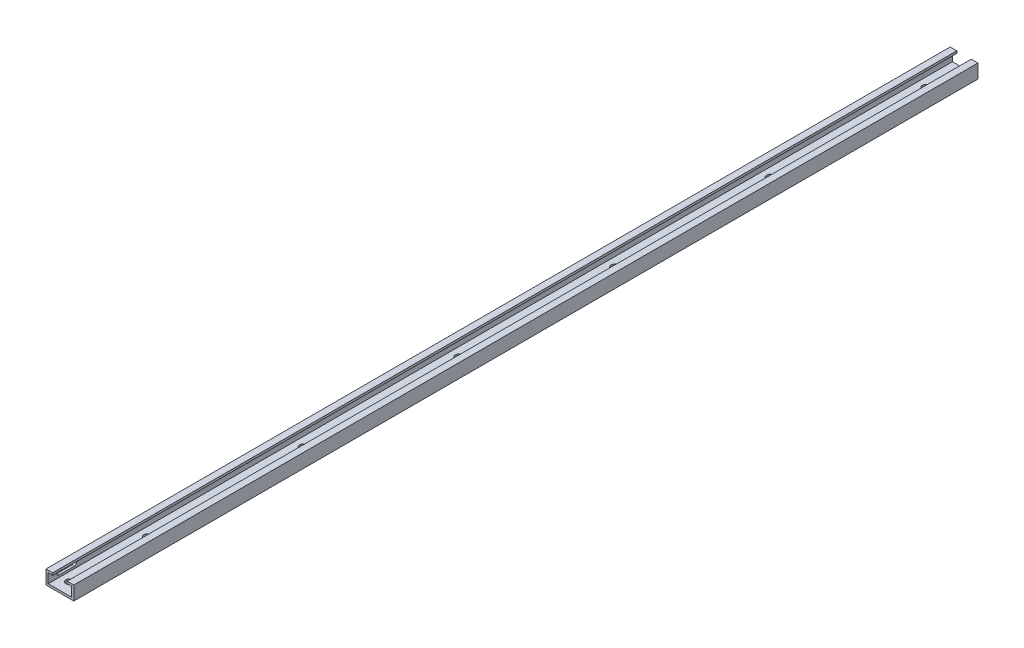
ISO-10303-21;
HEADER;
FILE_DESCRIPTION(('STEP AP214'),'2;1');
FILE_NAME('part.step','',(''),(''),'','','');
FILE_SCHEMA(('AUTOMOTIVE_DESIGN { 1 0 10303 214 1 1 1 1 }'));
ENDSEC;
DATA;
#1=APPLICATION_CONTEXT('core data for automotive mechanical design processes');
#2=APPLICATION_PROTOCOL_DEFINITION('international standard','automotive_design',2000,#1);
#3=PRODUCT_CONTEXT('',#1,'mechanical');
#4=PRODUCT('Part','Part','',(#3));
#5=PRODUCT_RELATED_PRODUCT_CATEGORY('part','',(#4));
#6=PRODUCT_DEFINITION_FORMATION('','',#4);
#7=PRODUCT_DEFINITION_CONTEXT('part definition',#1,'design');
#8=PRODUCT_DEFINITION('design','',#6,#7);
#9=PRODUCT_DEFINITION_SHAPE('','',#8);
#10=(LENGTH_UNIT() NAMED_UNIT(*) SI_UNIT(.MILLI.,.METRE.));
#11=(NAMED_UNIT(*) PLANE_ANGLE_UNIT() SI_UNIT($,.RADIAN.));
#12=(NAMED_UNIT(*) SI_UNIT($,.STERADIAN.) SOLID_ANGLE_UNIT());
#13=UNCERTAINTY_MEASURE_WITH_UNIT(LENGTH_MEASURE(1.E-05),#10,'distance_accuracy_value','');
#14=(GEOMETRIC_REPRESENTATION_CONTEXT(3) GLOBAL_UNCERTAINTY_ASSIGNED_CONTEXT((#13)) GLOBAL_UNIT_ASSIGNED_CONTEXT((#10,
#11,#12)) REPRESENTATION_CONTEXT('',''));
#15=CARTESIAN_POINT('',(0.,0.,0.));
#16=DIRECTION('',(0.,0.,1.));
#17=DIRECTION('',(1.,0.,0.));
#18=AXIS2_PLACEMENT_3D('',#15,#16,#17);
#19=CARTESIAN_POINT('',(-12.5,12.5,813.));
#20=DIRECTION('',(1.,0.,0.));
#21=DIRECTION('',(0.,1.,0.));
#22=AXIS2_PLACEMENT_3D('',#19,#20,#21);
#23=PLANE('',#22);
#24=DIRECTION('',(0.,-1.,0.));
#25=VECTOR('',#24,1.);
#26=CARTESIAN_POINT('',(-12.5,12.5,0.));
#27=LINE('',#26,#25);
#28=CARTESIAN_POINT('',(-12.5,12.5,0.));
#29=VERTEX_POINT('',#28);
#30=CARTESIAN_POINT('',(-12.5,0.,0.));
#31=VERTEX_POINT('',#30);
#32=EDGE_CURVE('E215',#29,#31,#27,.T.);
#33=ORIENTED_EDGE('',*,*,#32,.T.);
#34=DIRECTION('',(0.,0.,-1.));
#35=VECTOR('',#34,1.);
#36=CARTESIAN_POINT('',(-12.5,0.,813.));
#37=LINE('',#36,#35);
#38=CARTESIAN_POINT('',(-12.5,0.,813.));
#39=VERTEX_POINT('',#38);
#40=EDGE_CURVE('E260',#39,#31,#37,.T.);
#41=ORIENTED_EDGE('',*,*,#40,.F.);
#42=DIRECTION('',(0.,-1.,0.));
#43=VECTOR('',#42,1.);
#44=CARTESIAN_POINT('',(-12.5,12.5,813.));
#45=LINE('',#44,#43);
#46=CARTESIAN_POINT('',(-12.5,12.5,813.));
#47=VERTEX_POINT('',#46);
#48=EDGE_CURVE('E189',#47,#39,#45,.T.);
#49=ORIENTED_EDGE('',*,*,#48,.F.);
#50=DIRECTION('',(0.,0.,-1.));
#51=VECTOR('',#50,1.);
#52=CARTESIAN_POINT('',(-12.5,12.5,813.));
#53=LINE('',#52,#51);
#54=EDGE_CURVE('E263',#47,#29,#53,.T.);
#55=ORIENTED_EDGE('',*,*,#54,.T.);
#56=EDGE_LOOP('',(#33,#41,#49,#55));
#57=FACE_BOUND('',#56,.T.);
#58=CARTESIAN_POINT('',(-12.5,6.44911986244644,803.));
#59=DIRECTION('',(1.,0.,0.));
#60=DIRECTION('',(0.,1.,0.));
#61=AXIS2_PLACEMENT_3D('',#58,#59,#60);
#62=CIRCLE('',#61,2.5);
#63=CARTESIAN_POINT('',(-12.5,8.94911986244644,803.));
#64=VERTEX_POINT('',#63);
#65=CARTESIAN_POINT('',(-12.5,3.94911986244644,803.));
#66=VERTEX_POINT('',#65);
#67=EDGE_CURVE('E50',#64,#66,#62,.T.);
#68=ORIENTED_EDGE('',*,*,#67,.T.);
#69=DIRECTION('',(0.,0.,-1.));
#70=VECTOR('',#69,1.);
#71=CARTESIAN_POINT('',(-12.5,3.94911986244644,803.));
#72=LINE('',#71,#70);
#73=CARTESIAN_POINT('',(-12.5,3.94911986244644,789.837109693098));
#74=VERTEX_POINT('',#73);
#75=EDGE_CURVE('E156',#66,#74,#72,.T.);
#76=ORIENTED_EDGE('',*,*,#75,.T.);
#77=CARTESIAN_POINT('',(-12.5,6.44911986244644,789.837109693098));
#78=DIRECTION('',(1.,0.,0.));
#79=DIRECTION('',(0.,1.,0.));
#80=AXIS2_PLACEMENT_3D('',#77,#78,#79);
#81=CIRCLE('',#80,2.5);
#82=CARTESIAN_POINT('',(-12.5,8.94911986244644,789.837109693098));
#83=VERTEX_POINT('',#82);
#84=EDGE_CURVE('E162',#74,#83,#81,.T.);
#85=ORIENTED_EDGE('',*,*,#84,.T.);
#86=DIRECTION('',(0.,0.,1.));
#87=VECTOR('',#86,1.);
#88=CARTESIAN_POINT('',(-12.5,8.94911986244644,803.));
#89=LINE('',#88,#87);
#90=EDGE_CURVE('E165',#83,#64,#89,.T.);
#91=ORIENTED_EDGE('',*,*,#90,.T.);
#92=EDGE_LOOP('',(#68,#76,#85,#91));
#93=FACE_BOUND('',#92,.T.);
#94=ADVANCED_FACE('F35',(#57,#93),#23,.F.);
#95=CARTESIAN_POINT('',(-10.5,10.5,813.));
#96=DIRECTION('',(-1.,0.,0.));
#97=DIRECTION('',(0.,-1.,0.));
#98=AXIS2_PLACEMENT_3D('',#95,#96,#97);
#99=PLANE('',#98);
#100=DIRECTION('',(0.,1.,0.));
#101=VECTOR('',#100,1.);
#102=CARTESIAN_POINT('',(-10.5,10.5,0.));
#103=LINE('',#102,#101);
#104=CARTESIAN_POINT('',(-10.5,2.,0.));
#105=VERTEX_POINT('',#104);
#106=CARTESIAN_POINT('',(-10.5,10.5,0.));
#107=VERTEX_POINT('',#106);
#108=EDGE_CURVE('E231',#105,#107,#103,.T.);
#109=ORIENTED_EDGE('',*,*,#108,.T.);
#110=DIRECTION('',(0.,0.,-1.));
#111=VECTOR('',#110,1.);
#112=CARTESIAN_POINT('',(-10.5,10.5,813.));
#113=LINE('',#112,#111);
#114=CARTESIAN_POINT('',(-10.5,10.5,813.));
#115=VERTEX_POINT('',#114);
#116=EDGE_CURVE('E236',#115,#107,#113,.T.);
#117=ORIENTED_EDGE('',*,*,#116,.F.);
#118=DIRECTION('',(0.,1.,0.));
#119=VECTOR('',#118,1.);
#120=CARTESIAN_POINT('',(-10.5,10.5,813.));
#121=LINE('',#120,#119);
#122=CARTESIAN_POINT('',(-10.5,2.,813.));
#123=VERTEX_POINT('',#122);
#124=EDGE_CURVE('E205',#123,#115,#121,.T.);
#125=ORIENTED_EDGE('',*,*,#124,.F.);
#126=DIRECTION('',(0.,0.,-1.));
#127=VECTOR('',#126,1.);
#128=CARTESIAN_POINT('',(-10.5,2.,813.));
#129=LINE('',#128,#127);
#130=EDGE_CURVE('E239',#123,#105,#129,.T.);
#131=ORIENTED_EDGE('',*,*,#130,.T.);
#132=EDGE_LOOP('',(#109,#117,#125,#131));
#133=FACE_BOUND('',#132,.T.);
#134=CARTESIAN_POINT('',(-10.5,6.44911986244644,803.));
#135=DIRECTION('',(-1.,0.,0.));
#136=DIRECTION('',(0.,-1.,0.));
#137=AXIS2_PLACEMENT_3D('',#134,#135,#136);
#138=CIRCLE('',#137,2.5);
#139=CARTESIAN_POINT('',(-10.5,8.94911986244644,803.));
#140=VERTEX_POINT('',#139);
#141=CARTESIAN_POINT('',(-10.5,3.94911986244644,803.));
#142=VERTEX_POINT('',#141);
#143=EDGE_CURVE('E11',#140,#142,#138,.F.);
#144=ORIENTED_EDGE('',*,*,#143,.F.);
#145=DIRECTION('',(0.,0.,1.));
#146=VECTOR('',#145,1.);
#147=CARTESIAN_POINT('',(-10.5,8.94911986244644,813.));
#148=LINE('',#147,#146);
#149=CARTESIAN_POINT('',(-10.5,8.94911986244644,789.837109693098));
#150=VERTEX_POINT('',#149);
#151=EDGE_CURVE('E301',#150,#140,#148,.T.);
#152=ORIENTED_EDGE('',*,*,#151,.F.);
#153=CARTESIAN_POINT('',(-10.5,6.44911986244644,789.837109693098));
#154=DIRECTION('',(-1.,0.,0.));
#155=DIRECTION('',(0.,-1.,0.));
#156=AXIS2_PLACEMENT_3D('',#153,#154,#155);
#157=CIRCLE('',#156,2.5);
#158=CARTESIAN_POINT('',(-10.5,3.94911986244644,789.837109693098));
#159=VERTEX_POINT('',#158);
#160=EDGE_CURVE('E303',#159,#150,#157,.F.);
#161=ORIENTED_EDGE('',*,*,#160,.F.);
#162=DIRECTION('',(0.,0.,-1.));
#163=VECTOR('',#162,1.);
#164=CARTESIAN_POINT('',(-10.5,3.94911986244644,813.));
#165=LINE('',#164,#163);
#166=EDGE_CURVE('E43',#142,#159,#165,.T.);
#167=ORIENTED_EDGE('',*,*,#166,.F.);
#168=EDGE_LOOP('',(#144,#152,#161,#167));
#169=FACE_BOUND('',#168,.T.);
#170=ADVANCED_FACE('F309',(#133,#169),#99,.F.);
#171=CARTESIAN_POINT('',(-6.5,12.5,813.));
#172=DIRECTION('',(-1.,0.,0.));
#173=DIRECTION('',(0.,0.,1.));
#174=AXIS2_PLACEMENT_3D('',#171,#172,#173);
#175=PLANE('',#174);
#176=DIRECTION('',(0.,1.,0.));
#177=VECTOR('',#176,1.);
#178=CARTESIAN_POINT('',(-6.5,12.5,0.));
#179=LINE('',#178,#177);
#180=CARTESIAN_POINT('',(-6.5,10.5,0.));
#181=VERTEX_POINT('',#180);
#182=CARTESIAN_POINT('',(-6.5,12.5,0.));
#183=VERTEX_POINT('',#182);
#184=EDGE_CURVE('E210',#181,#183,#179,.T.);
#185=ORIENTED_EDGE('',*,*,#184,.T.);
#186=DIRECTION('',(0.,0.,-1.));
#187=VECTOR('',#186,1.);
#188=CARTESIAN_POINT('',(-6.5,12.5,813.));
#189=LINE('',#188,#187);
#190=CARTESIAN_POINT('',(-6.5,12.5,813.));
#191=VERTEX_POINT('',#190);
#192=EDGE_CURVE('E266',#191,#183,#189,.T.);
#193=ORIENTED_EDGE('',*,*,#192,.F.);
#194=DIRECTION('',(0.,1.,0.));
#195=VECTOR('',#194,1.);
#196=CARTESIAN_POINT('',(-6.5,12.5,813.));
#197=LINE('',#196,#195);
#198=CARTESIAN_POINT('',(-6.5,10.5,813.));
#199=VERTEX_POINT('',#198);
#200=EDGE_CURVE('E183',#199,#191,#197,.T.);
#201=ORIENTED_EDGE('',*,*,#200,.F.);
#202=DIRECTION('',(0.,0.,-1.));
#203=VECTOR('',#202,1.);
#204=CARTESIAN_POINT('',(-6.5,10.5,813.));
#205=LINE('',#204,#203);
#206=EDGE_CURVE('E209',#199,#181,#205,.T.);
#207=ORIENTED_EDGE('',*,*,#206,.T.);
#208=EDGE_LOOP('',(#185,#193,#201,#207));
#209=FACE_BOUND('',#208,.T.);
#210=ADVANCED_FACE('F324',(#209),#175,.F.);
#211=CARTESIAN_POINT('',(-6.5,12.5,813.));
#212=DIRECTION('',(0.,-1.,0.));
#213=DIRECTION('',(0.,0.,-1.));
#214=AXIS2_PLACEMENT_3D('',#211,#212,#213);
#215=PLANE('',#214);
#216=DIRECTION('',(-1.,0.,0.));
#217=VECTOR('',#216,1.);
#218=CARTESIAN_POINT('',(-6.5,12.5,0.));
#219=LINE('',#218,#217);
#220=EDGE_CURVE('E213',#183,#29,#219,.T.);
#221=ORIENTED_EDGE('',*,*,#220,.T.);
#222=ORIENTED_EDGE('',*,*,#54,.F.);
#223=DIRECTION('',(-1.,0.,0.));
#224=VECTOR('',#223,1.);
#225=CARTESIAN_POINT('',(-6.5,12.5,813.));
#226=LINE('',#225,#224);
#227=EDGE_CURVE('E186',#191,#47,#226,.T.);
#228=ORIENTED_EDGE('',*,*,#227,.F.);
#229=ORIENTED_EDGE('',*,*,#192,.T.);
#230=EDGE_LOOP('',(#221,#222,#228,#229));
#231=FACE_BOUND('',#230,.T.);
#232=ADVANCED_FACE('F331',(#231),#215,.F.);
#233=CARTESIAN_POINT('',(-12.5,0.,813.));
#234=DIRECTION('',(0.,1.,0.));
#235=DIRECTION('',(-1.,0.,0.));
#236=AXIS2_PLACEMENT_3D('',#233,#234,#235);
#237=PLANE('',#236);
#238=CARTESIAN_POINT('',(-2.40627346951916,0.,731.806864394795));
#239=DIRECTION('',(0.,-1.,0.));
#240=DIRECTION('',(0.,0.,-1.));
#241=AXIS2_PLACEMENT_3D('',#238,#239,#240);
#242=CIRCLE('',#241,3.29999999999999);
#243=CARTESIAN_POINT('',(-2.40627346951916,0.,728.506864394795));
#244=VERTEX_POINT('',#243);
#245=EDGE_CURVE('E152',#244,#244,#242,.T.);
#246=ORIENTED_EDGE('',*,*,#245,.F.);
#247=EDGE_LOOP('',(#246));
#248=FACE_BOUND('',#247,.T.);
#249=CARTESIAN_POINT('',(-2.40627346951916,0.,801.806864394795));
#250=DIRECTION('',(0.,-1.,0.));
#251=DIRECTION('',(0.,0.,-1.));
#252=AXIS2_PLACEMENT_3D('',#249,#250,#251);
#253=CIRCLE('',#252,3.29999999999999);
#254=CARTESIAN_POINT('',(-2.40627346951916,0.,798.506864394795));
#255=VERTEX_POINT('',#254);
#256=EDGE_CURVE('E179',#255,#255,#253,.T.);
#257=ORIENTED_EDGE('',*,*,#256,.F.);
#258=EDGE_LOOP('',(#257));
#259=FACE_BOUND('',#258,.T.);
#260=DIRECTION('',(1.,0.,0.));
#261=VECTOR('',#260,1.);
#262=CARTESIAN_POINT('',(-12.5,0.,0.));
#263=LINE('',#262,#261);
#264=CARTESIAN_POINT('',(12.5,0.,0.));
#265=VERTEX_POINT('',#264);
#266=EDGE_CURVE('E217',#31,#265,#263,.T.);
#267=ORIENTED_EDGE('',*,*,#266,.T.);
#268=DIRECTION('',(0.,0.,-1.));
#269=VECTOR('',#268,1.);
#270=CARTESIAN_POINT('',(12.5,0.,813.));
#271=LINE('',#270,#269);
#272=CARTESIAN_POINT('',(12.5,0.,813.));
#273=VERTEX_POINT('',#272);
#274=EDGE_CURVE('E257',#273,#265,#271,.T.);
#275=ORIENTED_EDGE('',*,*,#274,.F.);
#276=DIRECTION('',(1.,0.,0.));
#277=VECTOR('',#276,1.);
#278=CARTESIAN_POINT('',(-12.5,0.,813.));
#279=LINE('',#278,#277);
#280=EDGE_CURVE('E191',#39,#273,#279,.T.);
#281=ORIENTED_EDGE('',*,*,#280,.F.);
#282=ORIENTED_EDGE('',*,*,#40,.T.);
#283=EDGE_LOOP('',(#267,#275,#281,#282));
#284=FACE_BOUND('',#283,.T.);
#285=CARTESIAN_POINT('',(-2.40627346951916,0.,591.806864394795));
#286=DIRECTION('',(0.,-1.,0.));
#287=DIRECTION('',(0.,0.,-1.));
#288=AXIS2_PLACEMENT_3D('',#285,#286,#287);
#289=CIRCLE('',#288,3.29999999999999);
#290=CARTESIAN_POINT('',(-2.40627346951916,0.,588.506864394795));
#291=VERTEX_POINT('',#290);
#292=EDGE_CURVE('E269',#291,#291,#289,.T.);
#293=ORIENTED_EDGE('',*,*,#292,.F.);
#294=EDGE_LOOP('',(#293));
#295=FACE_BOUND('',#294,.T.);
#296=CARTESIAN_POINT('',(-2.40627346951916,0.,451.806864394795));
#297=DIRECTION('',(0.,-1.,0.));
#298=DIRECTION('',(0.,0.,-1.));
#299=AXIS2_PLACEMENT_3D('',#296,#297,#298);
#300=CIRCLE('',#299,3.29999999999999);
#301=CARTESIAN_POINT('',(-2.40627346951916,0.,448.506864394795));
#302=VERTEX_POINT('',#301);
#303=EDGE_CURVE('E277',#302,#302,#300,.T.);
#304=ORIENTED_EDGE('',*,*,#303,.F.);
#305=EDGE_LOOP('',(#304));
#306=FACE_BOUND('',#305,.T.);
#307=CARTESIAN_POINT('',(-2.40627346951916,0.,311.806864394795));
#308=DIRECTION('',(0.,-1.,0.));
#309=DIRECTION('',(0.,0.,-1.));
#310=AXIS2_PLACEMENT_3D('',#307,#308,#309);
#311=CIRCLE('',#310,3.29999999999999);
#312=CARTESIAN_POINT('',(-2.40627346951916,0.,308.506864394795));
#313=VERTEX_POINT('',#312);
#314=EDGE_CURVE('E283',#313,#313,#311,.T.);
#315=ORIENTED_EDGE('',*,*,#314,.F.);
#316=EDGE_LOOP('',(#315));
#317=FACE_BOUND('',#316,.T.);
#318=CARTESIAN_POINT('',(-2.40627346951916,0.,171.806864394795));
#319=DIRECTION('',(0.,-1.,0.));
#320=DIRECTION('',(0.,0.,-1.));
#321=AXIS2_PLACEMENT_3D('',#318,#319,#320);
#322=CIRCLE('',#321,3.29999999999999);
#323=CARTESIAN_POINT('',(-2.40627346951916,0.,168.506864394795));
#324=VERTEX_POINT('',#323);
#325=EDGE_CURVE('E289',#324,#324,#322,.T.);
#326=ORIENTED_EDGE('',*,*,#325,.F.);
#327=EDGE_LOOP('',(#326));
#328=FACE_BOUND('',#327,.T.);
#329=CARTESIAN_POINT('',(-2.40627346951916,0.,31.8068643947949));
#330=DIRECTION('',(0.,-1.,0.));
#331=DIRECTION('',(0.,0.,-1.));
#332=AXIS2_PLACEMENT_3D('',#329,#330,#331);
#333=CIRCLE('',#332,3.29999999999999);
#334=CARTESIAN_POINT('',(-2.40627346951916,0.,28.5068643947949));
#335=VERTEX_POINT('',#334);
#336=EDGE_CURVE('E295',#335,#335,#333,.T.);
#337=ORIENTED_EDGE('',*,*,#336,.F.);
#338=EDGE_LOOP('',(#337));
#339=FACE_BOUND('',#338,.T.);
#340=ADVANCED_FACE('F329',(#248,#259,#284,#295,#306,#317,#328,#339),#237,.F.);
#341=CARTESIAN_POINT('',(12.5,0.,813.));
#342=DIRECTION('',(-1.,0.,0.));
#343=DIRECTION('',(0.,-1.,0.));
#344=AXIS2_PLACEMENT_3D('',#341,#342,#343);
#345=PLANE('',#344);
#346=DIRECTION('',(0.,1.,0.));
#347=VECTOR('',#346,1.);
#348=CARTESIAN_POINT('',(12.5,0.,0.));
#349=LINE('',#348,#347);
#350=CARTESIAN_POINT('',(12.5,12.5,0.));
#351=VERTEX_POINT('',#350);
#352=EDGE_CURVE('E219',#265,#351,#349,.T.);
#353=ORIENTED_EDGE('',*,*,#352,.T.);
#354=DIRECTION('',(0.,0.,-1.));
#355=VECTOR('',#354,1.);
#356=CARTESIAN_POINT('',(12.5,12.5,813.));
#357=LINE('',#356,#355);
#358=CARTESIAN_POINT('',(12.5,12.5,813.));
#359=VERTEX_POINT('',#358);
#360=EDGE_CURVE('E254',#359,#351,#357,.T.);
#361=ORIENTED_EDGE('',*,*,#360,.F.);
#362=DIRECTION('',(0.,1.,0.));
#363=VECTOR('',#362,1.);
#364=CARTESIAN_POINT('',(12.5,0.,813.));
#365=LINE('',#364,#363);
#366=EDGE_CURVE('E193',#273,#359,#365,.T.);
#367=ORIENTED_EDGE('',*,*,#366,.F.);
#368=ORIENTED_EDGE('',*,*,#274,.T.);
#369=EDGE_LOOP('',(#353,#361,#367,#368));
#370=FACE_BOUND('',#369,.T.);
#371=ADVANCED_FACE('F393',(#370),#345,.F.);
#372=CARTESIAN_POINT('',(12.5,12.5,813.));
#373=DIRECTION('',(0.,-1.,0.));
#374=DIRECTION('',(1.,0.,0.));
#375=AXIS2_PLACEMENT_3D('',#372,#373,#374);
#376=PLANE('',#375);
#377=DIRECTION('',(-1.,0.,0.));
#378=VECTOR('',#377,1.);
#379=CARTESIAN_POINT('',(12.5,12.5,0.));
#380=LINE('',#379,#378);
#381=CARTESIAN_POINT('',(6.5,12.5,0.));
#382=VERTEX_POINT('',#381);
#383=EDGE_CURVE('E221',#351,#382,#380,.T.);
#384=ORIENTED_EDGE('',*,*,#383,.T.);
#385=DIRECTION('',(0.,0.,-1.));
#386=VECTOR('',#385,1.);
#387=CARTESIAN_POINT('',(6.5,12.5,813.));
#388=LINE('',#387,#386);
#389=CARTESIAN_POINT('',(6.5,12.5,813.));
#390=VERTEX_POINT('',#389);
#391=EDGE_CURVE('E251',#390,#382,#388,.T.);
#392=ORIENTED_EDGE('',*,*,#391,.F.);
#393=DIRECTION('',(-1.,0.,0.));
#394=VECTOR('',#393,1.);
#395=CARTESIAN_POINT('',(12.5,12.5,813.));
#396=LINE('',#395,#394);
#397=EDGE_CURVE('E195',#359,#390,#396,.T.);
#398=ORIENTED_EDGE('',*,*,#397,.F.);
#399=ORIENTED_EDGE('',*,*,#360,.T.);
#400=EDGE_LOOP('',(#384,#392,#398,#399));
#401=FACE_BOUND('',#400,.T.);
#402=ADVANCED_FACE('F390',(#401),#376,.F.);
#403=CARTESIAN_POINT('',(6.5,12.5,813.));
#404=DIRECTION('',(1.,0.,0.));
#405=DIRECTION('',(0.,0.,-1.));
#406=AXIS2_PLACEMENT_3D('',#403,#404,#405);
#407=PLANE('',#406);
#408=DIRECTION('',(0.,-1.,0.));
#409=VECTOR('',#408,1.);
#410=CARTESIAN_POINT('',(6.5,12.5,0.));
#411=LINE('',#410,#409);
#412=CARTESIAN_POINT('',(6.5,10.5,0.));
#413=VERTEX_POINT('',#412);
#414=EDGE_CURVE('E223',#382,#413,#411,.T.);
#415=ORIENTED_EDGE('',*,*,#414,.T.);
#416=DIRECTION('',(0.,0.,-1.));
#417=VECTOR('',#416,1.);
#418=CARTESIAN_POINT('',(6.5,10.5,813.));
#419=LINE('',#418,#417);
#420=CARTESIAN_POINT('',(6.5,10.5,813.));
#421=VERTEX_POINT('',#420);
#422=EDGE_CURVE('E248',#421,#413,#419,.T.);
#423=ORIENTED_EDGE('',*,*,#422,.F.);
#424=DIRECTION('',(0.,-1.,0.));
#425=VECTOR('',#424,1.);
#426=CARTESIAN_POINT('',(6.5,12.5,813.));
#427=LINE('',#426,#425);
#428=EDGE_CURVE('E197',#390,#421,#427,.T.);
#429=ORIENTED_EDGE('',*,*,#428,.F.);
#430=ORIENTED_EDGE('',*,*,#391,.T.);
#431=EDGE_LOOP('',(#415,#423,#429,#430));
#432=FACE_BOUND('',#431,.T.);
#433=ADVANCED_FACE('F386',(#432),#407,.F.);
#434=CARTESIAN_POINT('',(10.5,10.5,813.));
#435=DIRECTION('',(0.,1.,0.));
#436=DIRECTION('',(0.,0.,1.));
#437=AXIS2_PLACEMENT_3D('',#434,#435,#436);
#438=PLANE('',#437);
#439=DIRECTION('',(1.,0.,0.));
#440=VECTOR('',#439,1.);
#441=CARTESIAN_POINT('',(10.5,10.5,0.));
#442=LINE('',#441,#440);
#443=CARTESIAN_POINT('',(10.5,10.5,0.));
#444=VERTEX_POINT('',#443);
#445=EDGE_CURVE('E225',#413,#444,#442,.T.);
#446=ORIENTED_EDGE('',*,*,#445,.T.);
#447=DIRECTION('',(0.,0.,-1.));
#448=VECTOR('',#447,1.);
#449=CARTESIAN_POINT('',(10.5,10.5,813.));
#450=LINE('',#449,#448);
#451=CARTESIAN_POINT('',(10.5,10.5,813.));
#452=VERTEX_POINT('',#451);
#453=EDGE_CURVE('E245',#452,#444,#450,.T.);
#454=ORIENTED_EDGE('',*,*,#453,.F.);
#455=DIRECTION('',(1.,0.,0.));
#456=VECTOR('',#455,1.);
#457=CARTESIAN_POINT('',(10.5,10.5,813.));
#458=LINE('',#457,#456);
#459=EDGE_CURVE('E199',#421,#452,#458,.T.);
#460=ORIENTED_EDGE('',*,*,#459,.F.);
#461=ORIENTED_EDGE('',*,*,#422,.T.);
#462=EDGE_LOOP('',(#446,#454,#460,#461));
#463=FACE_BOUND('',#462,.T.);
#464=ADVANCED_FACE('F379',(#463),#438,.F.);
#465=CARTESIAN_POINT('',(10.5,2.,813.));
#466=DIRECTION('',(1.,0.,0.));
#467=DIRECTION('',(0.,0.,-1.));
#468=AXIS2_PLACEMENT_3D('',#465,#466,#467);
#469=PLANE('',#468);
#470=DIRECTION('',(0.,-1.,0.));
#471=VECTOR('',#470,1.);
#472=CARTESIAN_POINT('',(10.5,2.,0.));
#473=LINE('',#472,#471);
#474=CARTESIAN_POINT('',(10.5,2.,0.));
#475=VERTEX_POINT('',#474);
#476=EDGE_CURVE('E227',#444,#475,#473,.T.);
#477=ORIENTED_EDGE('',*,*,#476,.T.);
#478=DIRECTION('',(0.,0.,-1.));
#479=VECTOR('',#478,1.);
#480=CARTESIAN_POINT('',(10.5,2.,813.));
#481=LINE('',#480,#479);
#482=CARTESIAN_POINT('',(10.5,2.,813.));
#483=VERTEX_POINT('',#482);
#484=EDGE_CURVE('E242',#483,#475,#481,.T.);
#485=ORIENTED_EDGE('',*,*,#484,.F.);
#486=DIRECTION('',(0.,-1.,0.));
#487=VECTOR('',#486,1.);
#488=CARTESIAN_POINT('',(10.5,2.,813.));
#489=LINE('',#488,#487);
#490=EDGE_CURVE('E201',#452,#483,#489,.T.);
#491=ORIENTED_EDGE('',*,*,#490,.F.);
#492=ORIENTED_EDGE('',*,*,#453,.T.);
#493=EDGE_LOOP('',(#477,#485,#491,#492));
#494=FACE_BOUND('',#493,.T.);
#495=ADVANCED_FACE('F365',(#494),#469,.F.);
#496=CARTESIAN_POINT('',(-10.5,2.,813.));
#497=DIRECTION('',(0.,-1.,0.));
#498=DIRECTION('',(0.,0.,-1.));
#499=AXIS2_PLACEMENT_3D('',#496,#497,#498);
#500=PLANE('',#499);
#501=CARTESIAN_POINT('',(-2.40627346951916,2.,731.806864394795));
#502=DIRECTION('',(0.,-1.,0.));
#503=DIRECTION('',(0.,0.,-1.));
#504=AXIS2_PLACEMENT_3D('',#501,#502,#503);
#505=CIRCLE('',#504,3.29999999999999);
#506=CARTESIAN_POINT('',(-2.40627346951916,2.,728.506864394795));
#507=VERTEX_POINT('',#506);
#508=EDGE_CURVE('E176',#507,#507,#505,.T.);
#509=ORIENTED_EDGE('',*,*,#508,.T.);
#510=EDGE_LOOP('',(#509));
#511=FACE_BOUND('',#510,.T.);
#512=CARTESIAN_POINT('',(-2.40627346951916,2.,801.806864394795));
#513=DIRECTION('',(0.,-1.,0.));
#514=DIRECTION('',(0.,0.,-1.));
#515=AXIS2_PLACEMENT_3D('',#512,#513,#514);
#516=CIRCLE('',#515,3.29999999999999);
#517=CARTESIAN_POINT('',(-2.40627346951916,2.,798.506864394795));
#518=VERTEX_POINT('',#517);
#519=EDGE_CURVE('E182',#518,#518,#516,.T.);
#520=ORIENTED_EDGE('',*,*,#519,.T.);
#521=EDGE_LOOP('',(#520));
#522=FACE_BOUND('',#521,.T.);
#523=DIRECTION('',(-1.,0.,0.));
#524=VECTOR('',#523,1.);
#525=CARTESIAN_POINT('',(-10.5,2.,0.));
#526=LINE('',#525,#524);
#527=EDGE_CURVE('E229',#475,#105,#526,.T.);
#528=ORIENTED_EDGE('',*,*,#527,.T.);
#529=ORIENTED_EDGE('',*,*,#130,.F.);
#530=DIRECTION('',(-1.,0.,0.));
#531=VECTOR('',#530,1.);
#532=CARTESIAN_POINT('',(-10.5,2.,813.));
#533=LINE('',#532,#531);
#534=EDGE_CURVE('E203',#483,#123,#533,.T.);
#535=ORIENTED_EDGE('',*,*,#534,.F.);
#536=ORIENTED_EDGE('',*,*,#484,.T.);
#537=EDGE_LOOP('',(#528,#529,#535,#536));
#538=FACE_BOUND('',#537,.T.);
#539=CARTESIAN_POINT('',(-2.40627346951916,2.,591.806864394795));
#540=DIRECTION('',(0.,-1.,0.));
#541=DIRECTION('',(0.,0.,-1.));
#542=AXIS2_PLACEMENT_3D('',#539,#540,#541);
#543=CIRCLE('',#542,3.29999999999999);
#544=CARTESIAN_POINT('',(-2.40627346951916,2.,588.506864394795));
#545=VERTEX_POINT('',#544);
#546=EDGE_CURVE('E274',#545,#545,#543,.T.);
#547=ORIENTED_EDGE('',*,*,#546,.T.);
#548=EDGE_LOOP('',(#547));
#549=FACE_BOUND('',#548,.T.);
#550=CARTESIAN_POINT('',(-2.40627346951916,2.,451.806864394795));
#551=DIRECTION('',(0.,-1.,0.));
#552=DIRECTION('',(0.,0.,-1.));
#553=AXIS2_PLACEMENT_3D('',#550,#551,#552);
#554=CIRCLE('',#553,3.29999999999999);
#555=CARTESIAN_POINT('',(-2.40627346951916,2.,448.506864394795));
#556=VERTEX_POINT('',#555);
#557=EDGE_CURVE('E280',#556,#556,#554,.T.);
#558=ORIENTED_EDGE('',*,*,#557,.T.);
#559=EDGE_LOOP('',(#558));
#560=FACE_BOUND('',#559,.T.);
#561=CARTESIAN_POINT('',(-2.40627346951916,2.,311.806864394795));
#562=DIRECTION('',(0.,-1.,0.));
#563=DIRECTION('',(0.,0.,-1.));
#564=AXIS2_PLACEMENT_3D('',#561,#562,#563);
#565=CIRCLE('',#564,3.29999999999999);
#566=CARTESIAN_POINT('',(-2.40627346951916,2.,308.506864394795));
#567=VERTEX_POINT('',#566);
#568=EDGE_CURVE('E286',#567,#567,#565,.T.);
#569=ORIENTED_EDGE('',*,*,#568,.T.);
#570=EDGE_LOOP('',(#569));
#571=FACE_BOUND('',#570,.T.);
#572=CARTESIAN_POINT('',(-2.40627346951916,2.,171.806864394795));
#573=DIRECTION('',(0.,-1.,0.));
#574=DIRECTION('',(0.,0.,-1.));
#575=AXIS2_PLACEMENT_3D('',#572,#573,#574);
#576=CIRCLE('',#575,3.29999999999999);
#577=CARTESIAN_POINT('',(-2.40627346951916,2.,168.506864394795));
#578=VERTEX_POINT('',#577);
#579=EDGE_CURVE('E292',#578,#578,#576,.T.);
#580=ORIENTED_EDGE('',*,*,#579,.T.);
#581=EDGE_LOOP('',(#580));
#582=FACE_BOUND('',#581,.T.);
#583=CARTESIAN_POINT('',(-2.40627346951916,2.,31.8068643947949));
#584=DIRECTION('',(0.,-1.,0.));
#585=DIRECTION('',(0.,0.,-1.));
#586=AXIS2_PLACEMENT_3D('',#583,#584,#585);
#587=CIRCLE('',#586,3.29999999999999);
#588=CARTESIAN_POINT('',(-2.40627346951916,2.,28.5068643947949));
#589=VERTEX_POINT('',#588);
#590=EDGE_CURVE('E298',#589,#589,#587,.T.);
#591=ORIENTED_EDGE('',*,*,#590,.T.);
#592=EDGE_LOOP('',(#591));
#593=FACE_BOUND('',#592,.T.);
#594=ADVANCED_FACE('F361',(#511,#522,#538,#549,#560,#571,#582,#593),#500,.F.);
#595=CARTESIAN_POINT('',(-6.5,10.5,813.));
#596=DIRECTION('',(0.,1.,0.));
#597=DIRECTION('',(0.,0.,1.));
#598=AXIS2_PLACEMENT_3D('',#595,#596,#597);
#599=PLANE('',#598);
#600=DIRECTION('',(1.,0.,0.));
#601=VECTOR('',#600,1.);
#602=CARTESIAN_POINT('',(-6.5,10.5,0.));
#603=LINE('',#602,#601);
#604=EDGE_CURVE('E187',#107,#181,#603,.T.);
#605=ORIENTED_EDGE('',*,*,#604,.T.);
#606=ORIENTED_EDGE('',*,*,#206,.F.);
#607=DIRECTION('',(1.,0.,0.));
#608=VECTOR('',#607,1.);
#609=CARTESIAN_POINT('',(-6.5,10.5,813.));
#610=LINE('',#609,#608);
#611=EDGE_CURVE('E207',#115,#199,#610,.T.);
#612=ORIENTED_EDGE('',*,*,#611,.F.);
#613=ORIENTED_EDGE('',*,*,#116,.T.);
#614=EDGE_LOOP('',(#605,#606,#612,#613));
#615=FACE_BOUND('',#614,.T.);
#616=ADVANCED_FACE('F364',(#615),#599,.F.);
#617=CARTESIAN_POINT('',(0.,0.,813.));
#618=DIRECTION('',(0.,0.,-1.));
#619=DIRECTION('',(-1.,0.,0.));
#620=AXIS2_PLACEMENT_3D('',#617,#618,#619);
#621=PLANE('',#620);
#622=ORIENTED_EDGE('',*,*,#200,.T.);
#623=ORIENTED_EDGE('',*,*,#227,.T.);
#624=ORIENTED_EDGE('',*,*,#48,.T.);
#625=ORIENTED_EDGE('',*,*,#280,.T.);
#626=ORIENTED_EDGE('',*,*,#366,.T.);
#627=ORIENTED_EDGE('',*,*,#397,.T.);
#628=ORIENTED_EDGE('',*,*,#428,.T.);
#629=ORIENTED_EDGE('',*,*,#459,.T.);
#630=ORIENTED_EDGE('',*,*,#490,.T.);
#631=ORIENTED_EDGE('',*,*,#534,.T.);
#632=ORIENTED_EDGE('',*,*,#124,.T.);
#633=ORIENTED_EDGE('',*,*,#611,.T.);
#634=EDGE_LOOP('',(#622,#623,#624,#625,#626,#627,#628,#629,#630,#631,#632,#633));
#635=FACE_BOUND('',#634,.T.);
#636=ADVANCED_FACE('F375',(#635),#621,.F.);
#637=CARTESIAN_POINT('',(0.,0.,0.));
#638=DIRECTION('',(0.,0.,-1.));
#639=DIRECTION('',(-1.,0.,0.));
#640=AXIS2_PLACEMENT_3D('',#637,#638,#639);
#641=PLANE('',#640);
#642=ORIENTED_EDGE('',*,*,#184,.F.);
#643=ORIENTED_EDGE('',*,*,#604,.F.);
#644=ORIENTED_EDGE('',*,*,#108,.F.);
#645=ORIENTED_EDGE('',*,*,#527,.F.);
#646=ORIENTED_EDGE('',*,*,#476,.F.);
#647=ORIENTED_EDGE('',*,*,#445,.F.);
#648=ORIENTED_EDGE('',*,*,#414,.F.);
#649=ORIENTED_EDGE('',*,*,#383,.F.);
#650=ORIENTED_EDGE('',*,*,#352,.F.);
#651=ORIENTED_EDGE('',*,*,#266,.F.);
#652=ORIENTED_EDGE('',*,*,#32,.F.);
#653=ORIENTED_EDGE('',*,*,#220,.F.);
#654=EDGE_LOOP('',(#642,#643,#644,#645,#646,#647,#648,#649,#650,#651,#652,#653));
#655=FACE_BOUND('',#654,.T.);
#656=ADVANCED_FACE('F412',(#655),#641,.T.);
#657=CARTESIAN_POINT('',(-2.40627346951916,0.,801.806864394795));
#658=DIRECTION('',(0.,-1.,0.));
#659=DIRECTION('',(0.,0.,-1.));
#660=AXIS2_PLACEMENT_3D('',#657,#658,#659);
#661=CYLINDRICAL_SURFACE('',#660,3.29999999999999);
#662=ORIENTED_EDGE('',*,*,#256,.T.);
#663=EDGE_LOOP('',(#662));
#664=FACE_BOUND('',#663,.T.);
#665=ORIENTED_EDGE('',*,*,#519,.F.);
#666=EDGE_LOOP('',(#665));
#667=FACE_BOUND('',#666,.T.);
#668=ADVANCED_FACE('F463',(#664,#667),#661,.F.);
#669=CARTESIAN_POINT('',(-2.40627346951916,0.,731.806864394795));
#670=DIRECTION('',(0.,-1.,0.));
#671=DIRECTION('',(0.,0.,-1.));
#672=AXIS2_PLACEMENT_3D('',#669,#670,#671);
#673=CYLINDRICAL_SURFACE('',#672,3.29999999999999);
#674=ORIENTED_EDGE('',*,*,#245,.T.);
#675=EDGE_LOOP('',(#674));
#676=FACE_BOUND('',#675,.T.);
#677=ORIENTED_EDGE('',*,*,#508,.F.);
#678=EDGE_LOOP('',(#677));
#679=FACE_BOUND('',#678,.T.);
#680=ADVANCED_FACE('F342',(#676,#679),#673,.F.);
#681=CARTESIAN_POINT('',(-2.40627346951916,0.,591.806864394795));
#682=DIRECTION('',(0.,-1.,0.));
#683=DIRECTION('',(0.,0.,-1.));
#684=AXIS2_PLACEMENT_3D('',#681,#682,#683);
#685=CYLINDRICAL_SURFACE('',#684,3.29999999999999);
#686=ORIENTED_EDGE('',*,*,#292,.T.);
#687=EDGE_LOOP('',(#686));
#688=FACE_BOUND('',#687,.T.);
#689=ORIENTED_EDGE('',*,*,#546,.F.);
#690=EDGE_LOOP('',(#689));
#691=FACE_BOUND('',#690,.T.);
#692=ADVANCED_FACE('F338',(#688,#691),#685,.F.);
#693=CARTESIAN_POINT('',(-2.40627346951916,0.,451.806864394795));
#694=DIRECTION('',(0.,-1.,0.));
#695=DIRECTION('',(0.,0.,-1.));
#696=AXIS2_PLACEMENT_3D('',#693,#694,#695);
#697=CYLINDRICAL_SURFACE('',#696,3.29999999999999);
#698=ORIENTED_EDGE('',*,*,#303,.T.);
#699=EDGE_LOOP('',(#698));
#700=FACE_BOUND('',#699,.T.);
#701=ORIENTED_EDGE('',*,*,#557,.F.);
#702=EDGE_LOOP('',(#701));
#703=FACE_BOUND('',#702,.T.);
#704=ADVANCED_FACE('F341',(#700,#703),#697,.F.);
#705=CARTESIAN_POINT('',(-2.40627346951916,0.,311.806864394795));
#706=DIRECTION('',(0.,-1.,0.));
#707=DIRECTION('',(0.,0.,-1.));
#708=AXIS2_PLACEMENT_3D('',#705,#706,#707);
#709=CYLINDRICAL_SURFACE('',#708,3.29999999999999);
#710=ORIENTED_EDGE('',*,*,#314,.T.);
#711=EDGE_LOOP('',(#710));
#712=FACE_BOUND('',#711,.T.);
#713=ORIENTED_EDGE('',*,*,#568,.F.);
#714=EDGE_LOOP('',(#713));
#715=FACE_BOUND('',#714,.T.);
#716=ADVANCED_FACE('F346',(#712,#715),#709,.F.);
#717=CARTESIAN_POINT('',(-2.40627346951916,0.,171.806864394795));
#718=DIRECTION('',(0.,-1.,0.));
#719=DIRECTION('',(0.,0.,-1.));
#720=AXIS2_PLACEMENT_3D('',#717,#718,#719);
#721=CYLINDRICAL_SURFACE('',#720,3.29999999999999);
#722=ORIENTED_EDGE('',*,*,#325,.T.);
#723=EDGE_LOOP('',(#722));
#724=FACE_BOUND('',#723,.T.);
#725=ORIENTED_EDGE('',*,*,#579,.F.);
#726=EDGE_LOOP('',(#725));
#727=FACE_BOUND('',#726,.T.);
#728=ADVANCED_FACE('F349',(#724,#727),#721,.F.);
#729=CARTESIAN_POINT('',(-2.40627346951916,0.,31.8068643947949));
#730=DIRECTION('',(0.,-1.,0.));
#731=DIRECTION('',(0.,0.,-1.));
#732=AXIS2_PLACEMENT_3D('',#729,#730,#731);
#733=CYLINDRICAL_SURFACE('',#732,3.29999999999999);
#734=ORIENTED_EDGE('',*,*,#336,.T.);
#735=EDGE_LOOP('',(#734));
#736=FACE_BOUND('',#735,.T.);
#737=ORIENTED_EDGE('',*,*,#590,.F.);
#738=EDGE_LOOP('',(#737));
#739=FACE_BOUND('',#738,.T.);
#740=ADVANCED_FACE('F37',(#736,#739),#733,.F.);
#741=CARTESIAN_POINT('',(-7.5,6.44911986244644,803.));
#742=DIRECTION('',(-1.,0.,0.));
#743=DIRECTION('',(0.,-1.,0.));
#744=AXIS2_PLACEMENT_3D('',#741,#742,#743);
#745=CYLINDRICAL_SURFACE('',#744,2.5);
#746=ORIENTED_EDGE('',*,*,#143,.T.);
#747=DIRECTION('',(-1.,0.,0.));
#748=VECTOR('',#747,1.);
#749=CARTESIAN_POINT('',(-7.5,3.94911986244644,803.));
#750=LINE('',#749,#748);
#751=EDGE_CURVE('E146',#142,#66,#750,.T.);
#752=ORIENTED_EDGE('',*,*,#751,.T.);
#753=ORIENTED_EDGE('',*,*,#67,.F.);
#754=DIRECTION('',(-1.,0.,0.));
#755=VECTOR('',#754,1.);
#756=CARTESIAN_POINT('',(-7.5,8.94911986244644,803.));
#757=LINE('',#756,#755);
#758=EDGE_CURVE('E170',#140,#64,#757,.T.);
#759=ORIENTED_EDGE('',*,*,#758,.F.);
#760=EDGE_LOOP('',(#746,#752,#753,#759));
#761=FACE_BOUND('',#760,.T.);
#762=ADVANCED_FACE('F148',(#761),#745,.F.);
#763=CARTESIAN_POINT('',(-7.5,3.94911986244644,803.));
#764=DIRECTION('',(0.,1.,0.));
#765=DIRECTION('',(-1.,0.,0.));
#766=AXIS2_PLACEMENT_3D('',#763,#764,#765);
#767=PLANE('',#766);
#768=ORIENTED_EDGE('',*,*,#166,.T.);
#769=DIRECTION('',(-1.,0.,0.));
#770=VECTOR('',#769,1.);
#771=CARTESIAN_POINT('',(-7.5,3.94911986244644,789.837109693098));
#772=LINE('',#771,#770);
#773=EDGE_CURVE('E153',#159,#74,#772,.T.);
#774=ORIENTED_EDGE('',*,*,#773,.T.);
#775=ORIENTED_EDGE('',*,*,#75,.F.);
#776=ORIENTED_EDGE('',*,*,#751,.F.);
#777=EDGE_LOOP('',(#768,#774,#775,#776));
#778=FACE_BOUND('',#777,.T.);
#779=ADVANCED_FACE('F157',(#778),#767,.T.);
#780=CARTESIAN_POINT('',(-7.5,6.44911986244644,789.837109693098));
#781=DIRECTION('',(-1.,0.,0.));
#782=DIRECTION('',(0.,-1.,0.));
#783=AXIS2_PLACEMENT_3D('',#780,#781,#782);
#784=CYLINDRICAL_SURFACE('',#783,2.5);
#785=ORIENTED_EDGE('',*,*,#160,.T.);
#786=DIRECTION('',(-1.,0.,0.));
#787=VECTOR('',#786,1.);
#788=CARTESIAN_POINT('',(-7.5,8.94911986244644,789.837109693098));
#789=LINE('',#788,#787);
#790=EDGE_CURVE('E58',#150,#83,#789,.T.);
#791=ORIENTED_EDGE('',*,*,#790,.T.);
#792=ORIENTED_EDGE('',*,*,#84,.F.);
#793=ORIENTED_EDGE('',*,*,#773,.F.);
#794=EDGE_LOOP('',(#785,#791,#792,#793));
#795=FACE_BOUND('',#794,.T.);
#796=ADVANCED_FACE('F307',(#795),#784,.F.);
#797=CARTESIAN_POINT('',(-7.5,8.94911986244644,803.));
#798=DIRECTION('',(0.,-1.,0.));
#799=DIRECTION('',(1.,0.,0.));
#800=AXIS2_PLACEMENT_3D('',#797,#798,#799);
#801=PLANE('',#800);
#802=ORIENTED_EDGE('',*,*,#151,.T.);
#803=ORIENTED_EDGE('',*,*,#758,.T.);
#804=ORIENTED_EDGE('',*,*,#90,.F.);
#805=ORIENTED_EDGE('',*,*,#790,.F.);
#806=EDGE_LOOP('',(#802,#803,#804,#805));
#807=FACE_BOUND('',#806,.T.);
#808=ADVANCED_FACE('F310',(#807),#801,.T.);
#809=CLOSED_SHELL('',(#94,#170,#210,#232,#340,#371,#402,#433,#464,#495,#594,#616,#636,#656,#668,
#680,#692,#704,#716,#728,#740,#762,#779,#796,#808));
#810=MANIFOLD_SOLID_BREP('B2',#809);
#811=ADVANCED_BREP_SHAPE_REPRESENTATION('',(#18,#810),#14);
#812=SHAPE_DEFINITION_REPRESENTATION(#9,#811);
ENDSEC;
END-ISO-10303-21;
